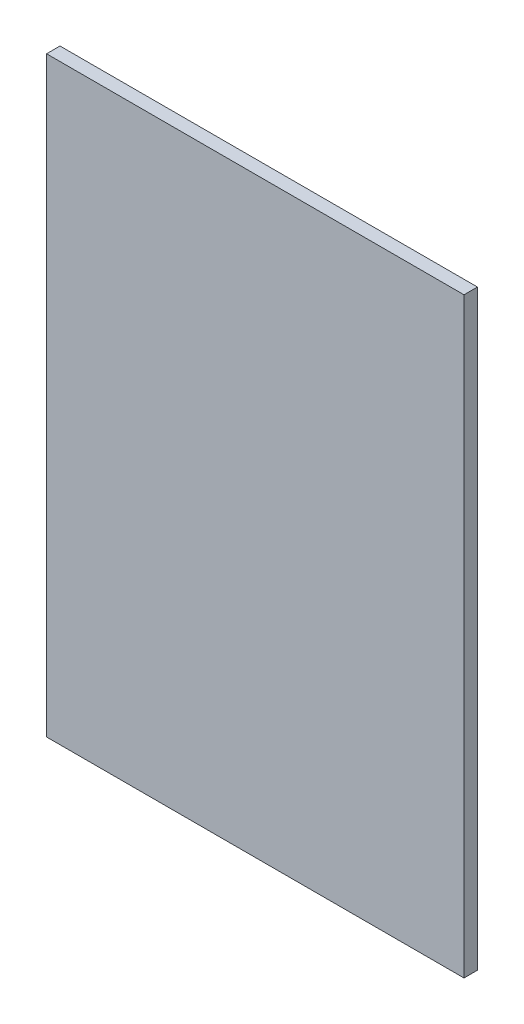
ISO-10303-21;
HEADER;
FILE_DESCRIPTION(('STEP AP214'),'2;1');
FILE_NAME('part.step','',(''),(''),'','','');
FILE_SCHEMA(('AUTOMOTIVE_DESIGN { 1 0 10303 214 1 1 1 1 }'));
ENDSEC;
DATA;
#1=APPLICATION_CONTEXT('core data for automotive mechanical design processes');
#2=APPLICATION_PROTOCOL_DEFINITION('international standard','automotive_design',2000,#1);
#3=PRODUCT_CONTEXT('',#1,'mechanical');
#4=PRODUCT('Part','Part','',(#3));
#5=PRODUCT_RELATED_PRODUCT_CATEGORY('part','',(#4));
#6=PRODUCT_DEFINITION_FORMATION('','',#4);
#7=PRODUCT_DEFINITION_CONTEXT('part definition',#1,'design');
#8=PRODUCT_DEFINITION('design','',#6,#7);
#9=PRODUCT_DEFINITION_SHAPE('','',#8);
#10=(LENGTH_UNIT() NAMED_UNIT(*) SI_UNIT(.MILLI.,.METRE.));
#11=(NAMED_UNIT(*) PLANE_ANGLE_UNIT() SI_UNIT($,.RADIAN.));
#12=(NAMED_UNIT(*) SI_UNIT($,.STERADIAN.) SOLID_ANGLE_UNIT());
#13=UNCERTAINTY_MEASURE_WITH_UNIT(LENGTH_MEASURE(1.E-05),#10,'distance_accuracy_value','');
#14=(GEOMETRIC_REPRESENTATION_CONTEXT(3) GLOBAL_UNCERTAINTY_ASSIGNED_CONTEXT((#13)) GLOBAL_UNIT_ASSIGNED_CONTEXT((#10,
#11,#12)) REPRESENTATION_CONTEXT('',''));
#15=CARTESIAN_POINT('',(0.,0.,0.));
#16=DIRECTION('',(0.,0.,1.));
#17=DIRECTION('',(1.,0.,0.));
#18=AXIS2_PLACEMENT_3D('',#15,#16,#17);
#19=CARTESIAN_POINT('',(-3.767303179835,-13.1467308609,51.8659));
#20=DIRECTION('',(0.,0.,-1.));
#21=DIRECTION('',(-1.,0.,0.));
#22=AXIS2_PLACEMENT_3D('',#19,#20,#21);
#23=PLANE('',#22);
#24=DIRECTION('',(0.,1.,0.));
#25=VECTOR('',#24,1.);
#26=CARTESIAN_POINT('',(-3.767303179835,-12.0467308609,51.8659));
#27=LINE('',#26,#25);
#28=CARTESIAN_POINT('',(-3.767303179835,-13.1467308609,51.8659));
#29=VERTEX_POINT('',#28);
#30=CARTESIAN_POINT('',(-3.767303179835,-10.9467308609,51.8659));
#31=VERTEX_POINT('',#30);
#32=EDGE_CURVE('E57',#29,#31,#27,.T.);
#33=ORIENTED_EDGE('',*,*,#32,.F.);
#34=DIRECTION('',(1.,0.,0.));
#35=VECTOR('',#34,1.);
#36=CARTESIAN_POINT('',(-4.543354379502,-13.1467308609,51.8659));
#37=LINE('',#36,#35);
#38=CARTESIAN_POINT('',(-5.319405579169,-13.1467308609,51.8659));
#39=VERTEX_POINT('',#38);
#40=EDGE_CURVE('E21',#39,#29,#37,.T.);
#41=ORIENTED_EDGE('',*,*,#40,.F.);
#42=DIRECTION('',(0.,-1.,0.));
#43=VECTOR('',#42,1.);
#44=CARTESIAN_POINT('',(-5.319405579169,-12.0467308609,51.8659));
#45=LINE('',#44,#43);
#46=CARTESIAN_POINT('',(-5.319405579169,-10.9467308609,51.8659));
#47=VERTEX_POINT('',#46);
#48=EDGE_CURVE('E80',#47,#39,#45,.T.);
#49=ORIENTED_EDGE('',*,*,#48,.F.);
#50=DIRECTION('',(-1.,0.,0.));
#51=VECTOR('',#50,1.);
#52=CARTESIAN_POINT('',(-4.543354379502,-10.9467308609,51.8659));
#53=LINE('',#52,#51);
#54=EDGE_CURVE('E69',#31,#47,#53,.T.);
#55=ORIENTED_EDGE('',*,*,#54,.F.);
#56=EDGE_LOOP('',(#33,#41,#49,#55));
#57=FACE_BOUND('',#56,.T.);
#58=ADVANCED_FACE('F17',(#57),#23,.T.);
#59=CARTESIAN_POINT('',(-5.319405579169,-13.1467308609,51.9159));
#60=DIRECTION('',(0.,-1.,0.));
#61=DIRECTION('',(0.,0.,-1.));
#62=AXIS2_PLACEMENT_3D('',#59,#60,#61);
#63=PLANE('',#62);
#64=DIRECTION('',(1.,0.,0.));
#65=VECTOR('',#64,1.);
#66=CARTESIAN_POINT('',(-4.543354379502,-13.1467308609,51.9159));
#67=LINE('',#66,#65);
#68=CARTESIAN_POINT('',(-5.319405579169,-13.1467308609,51.9159));
#69=VERTEX_POINT('',#68);
#70=CARTESIAN_POINT('',(-3.767303179835,-13.1467308609,51.9159));
#71=VERTEX_POINT('',#70);
#72=EDGE_CURVE('E84',#69,#71,#67,.T.);
#73=ORIENTED_EDGE('',*,*,#72,.F.);
#74=DIRECTION('',(0.,0.,1.));
#75=VECTOR('',#74,1.);
#76=CARTESIAN_POINT('',(-5.319405579169,-13.1467308609,51.8909));
#77=LINE('',#76,#75);
#78=EDGE_CURVE('E66',#39,#69,#77,.T.);
#79=ORIENTED_EDGE('',*,*,#78,.F.);
#80=ORIENTED_EDGE('',*,*,#40,.T.);
#81=DIRECTION('',(0.,0.,-1.));
#82=VECTOR('',#81,1.);
#83=CARTESIAN_POINT('',(-3.767303179835,-13.1467308609,51.8909));
#84=LINE('',#83,#82);
#85=EDGE_CURVE('E63',#71,#29,#84,.T.);
#86=ORIENTED_EDGE('',*,*,#85,.F.);
#87=EDGE_LOOP('',(#73,#79,#80,#86));
#88=FACE_BOUND('',#87,.T.);
#89=ADVANCED_FACE('F62',(#88),#63,.T.);
#90=CARTESIAN_POINT('',(-3.767303179835,-13.1467308609,51.9159));
#91=DIRECTION('',(1.,0.,0.));
#92=DIRECTION('',(0.,0.,-1.));
#93=AXIS2_PLACEMENT_3D('',#90,#91,#92);
#94=PLANE('',#93);
#95=ORIENTED_EDGE('',*,*,#85,.T.);
#96=ORIENTED_EDGE('',*,*,#32,.T.);
#97=DIRECTION('',(0.,0.,-1.));
#98=VECTOR('',#97,1.);
#99=CARTESIAN_POINT('',(-3.767303179835,-10.9467308609,51.8909));
#100=LINE('',#99,#98);
#101=CARTESIAN_POINT('',(-3.767303179835,-10.9467308609,51.9159));
#102=VERTEX_POINT('',#101);
#103=EDGE_CURVE('E71',#102,#31,#100,.T.);
#104=ORIENTED_EDGE('',*,*,#103,.F.);
#105=DIRECTION('',(0.,1.,0.));
#106=VECTOR('',#105,1.);
#107=CARTESIAN_POINT('',(-3.767303179835,-12.0467308609,51.9159));
#108=LINE('',#107,#106);
#109=EDGE_CURVE('E75',#71,#102,#108,.T.);
#110=ORIENTED_EDGE('',*,*,#109,.F.);
#111=EDGE_LOOP('',(#95,#96,#104,#110));
#112=FACE_BOUND('',#111,.T.);
#113=ADVANCED_FACE('F73',(#112),#94,.T.);
#114=CARTESIAN_POINT('',(-5.319405579169,-10.9467308609,51.8659));
#115=DIRECTION('',(0.,1.,0.));
#116=DIRECTION('',(0.,0.,1.));
#117=AXIS2_PLACEMENT_3D('',#114,#115,#116);
#118=PLANE('',#117);
#119=ORIENTED_EDGE('',*,*,#54,.T.);
#120=DIRECTION('',(0.,0.,-1.));
#121=VECTOR('',#120,1.);
#122=CARTESIAN_POINT('',(-5.319405579169,-10.9467308609,51.8909));
#123=LINE('',#122,#121);
#124=CARTESIAN_POINT('',(-5.319405579169,-10.9467308609,51.9159));
#125=VERTEX_POINT('',#124);
#126=EDGE_CURVE('E36',#125,#47,#123,.T.);
#127=ORIENTED_EDGE('',*,*,#126,.F.);
#128=DIRECTION('',(-1.,0.,0.));
#129=VECTOR('',#128,1.);
#130=CARTESIAN_POINT('',(-4.543354379502,-10.9467308609,51.9159));
#131=LINE('',#130,#129);
#132=EDGE_CURVE('E27',#102,#125,#131,.T.);
#133=ORIENTED_EDGE('',*,*,#132,.F.);
#134=ORIENTED_EDGE('',*,*,#103,.T.);
#135=EDGE_LOOP('',(#119,#127,#133,#134));
#136=FACE_BOUND('',#135,.T.);
#137=ADVANCED_FACE('F89',(#136),#118,.T.);
#138=CARTESIAN_POINT('',(-5.319405579169,-13.1467308609,51.8659));
#139=DIRECTION('',(-1.,0.,0.));
#140=DIRECTION('',(0.,0.,1.));
#141=AXIS2_PLACEMENT_3D('',#138,#139,#140);
#142=PLANE('',#141);
#143=DIRECTION('',(0.,-1.,0.));
#144=VECTOR('',#143,1.);
#145=CARTESIAN_POINT('',(-5.319405579169,-12.0467308609,51.9159));
#146=LINE('',#145,#144);
#147=EDGE_CURVE('E11',#125,#69,#146,.T.);
#148=ORIENTED_EDGE('',*,*,#147,.F.);
#149=ORIENTED_EDGE('',*,*,#126,.T.);
#150=ORIENTED_EDGE('',*,*,#48,.T.);
#151=ORIENTED_EDGE('',*,*,#78,.T.);
#152=EDGE_LOOP('',(#148,#149,#150,#151));
#153=FACE_BOUND('',#152,.T.);
#154=ADVANCED_FACE('F91',(#153),#142,.T.);
#155=CARTESIAN_POINT('',(-5.319405579169,-13.1467308609,51.9159));
#156=DIRECTION('',(0.,0.,1.));
#157=DIRECTION('',(1.,0.,0.));
#158=AXIS2_PLACEMENT_3D('',#155,#156,#157);
#159=PLANE('',#158);
#160=ORIENTED_EDGE('',*,*,#132,.T.);
#161=ORIENTED_EDGE('',*,*,#147,.T.);
#162=ORIENTED_EDGE('',*,*,#72,.T.);
#163=ORIENTED_EDGE('',*,*,#109,.T.);
#164=EDGE_LOOP('',(#160,#161,#162,#163));
#165=FACE_BOUND('',#164,.T.);
#166=ADVANCED_FACE('F19',(#165),#159,.T.);
#167=CLOSED_SHELL('',(#58,#89,#113,#137,#154,#166));
#168=MANIFOLD_SOLID_BREP('B1',#167);
#169=ADVANCED_BREP_SHAPE_REPRESENTATION('',(#18,#168),#14);
#170=SHAPE_DEFINITION_REPRESENTATION(#9,#169);
ENDSEC;
END-ISO-10303-21;
